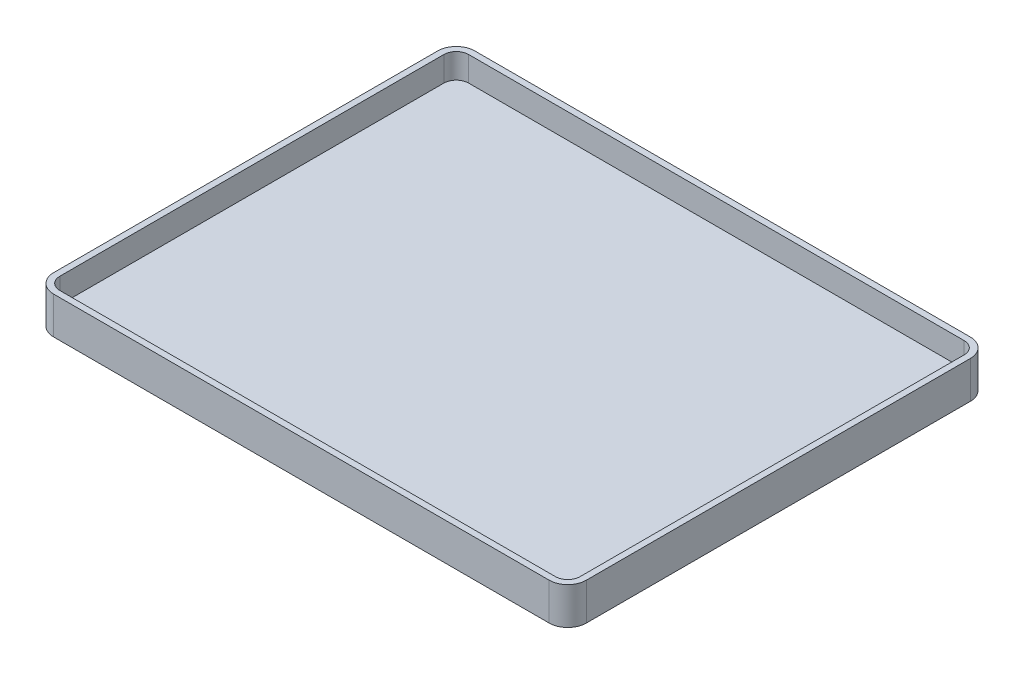
ISO-10303-21;
HEADER;
FILE_DESCRIPTION(('STEP AP214'),'2;1');
FILE_NAME('part.step','',(''),(''),'','','');
FILE_SCHEMA(('AUTOMOTIVE_DESIGN { 1 0 10303 214 1 1 1 1 }'));
ENDSEC;
DATA;
#1=APPLICATION_CONTEXT('core data for automotive mechanical design processes');
#2=APPLICATION_PROTOCOL_DEFINITION('international standard','automotive_design',2000,#1);
#3=PRODUCT_CONTEXT('',#1,'mechanical');
#4=PRODUCT('Part','Part','',(#3));
#5=PRODUCT_RELATED_PRODUCT_CATEGORY('part','',(#4));
#6=PRODUCT_DEFINITION_FORMATION('','',#4);
#7=PRODUCT_DEFINITION_CONTEXT('part definition',#1,'design');
#8=PRODUCT_DEFINITION('design','',#6,#7);
#9=PRODUCT_DEFINITION_SHAPE('','',#8);
#10=(LENGTH_UNIT() NAMED_UNIT(*) SI_UNIT(.MILLI.,.METRE.));
#11=(NAMED_UNIT(*) PLANE_ANGLE_UNIT() SI_UNIT($,.RADIAN.));
#12=(NAMED_UNIT(*) SI_UNIT($,.STERADIAN.) SOLID_ANGLE_UNIT());
#13=UNCERTAINTY_MEASURE_WITH_UNIT(LENGTH_MEASURE(1.E-05),#10,'distance_accuracy_value','');
#14=(GEOMETRIC_REPRESENTATION_CONTEXT(3) GLOBAL_UNCERTAINTY_ASSIGNED_CONTEXT((#13)) GLOBAL_UNIT_ASSIGNED_CONTEXT((#10,
#11,#12)) REPRESENTATION_CONTEXT('',''));
#15=CARTESIAN_POINT('',(0.,0.,0.));
#16=DIRECTION('',(0.,0.,1.));
#17=DIRECTION('',(1.,0.,0.));
#18=AXIS2_PLACEMENT_3D('',#15,#16,#17);
#19=CARTESIAN_POINT('',(0.,19.05,0.));
#20=DIRECTION('',(1.,0.,0.));
#21=DIRECTION('',(0.,0.,-1.));
#22=AXIS2_PLACEMENT_3D('',#19,#20,#21);
#23=PLANE('',#22);
#24=DIRECTION('',(0.,0.,1.));
#25=VECTOR('',#24,1.);
#26=CARTESIAN_POINT('',(0.,0.,0.));
#27=LINE('',#26,#25);
#28=CARTESIAN_POINT('',(0.,0.,-206.375));
#29=VERTEX_POINT('',#28);
#30=CARTESIAN_POINT('',(0.,0.,-9.525));
#31=VERTEX_POINT('',#30);
#32=EDGE_CURVE('E206',#29,#31,#27,.T.);
#33=ORIENTED_EDGE('',*,*,#32,.T.);
#34=DIRECTION('',(0.,-1.,0.));
#35=VECTOR('',#34,1.);
#36=CARTESIAN_POINT('',(0.,19.05,-9.525));
#37=LINE('',#36,#35);
#38=CARTESIAN_POINT('',(0.,19.05,-9.525));
#39=VERTEX_POINT('',#38);
#40=EDGE_CURVE('E11',#31,#39,#37,.F.);
#41=ORIENTED_EDGE('',*,*,#40,.T.);
#42=DIRECTION('',(0.,0.,1.));
#43=VECTOR('',#42,1.);
#44=CARTESIAN_POINT('',(0.,19.05,0.));
#45=LINE('',#44,#43);
#46=CARTESIAN_POINT('',(0.,19.05,-206.375));
#47=VERTEX_POINT('',#46);
#48=EDGE_CURVE('E218',#47,#39,#45,.T.);
#49=ORIENTED_EDGE('',*,*,#48,.F.);
#50=DIRECTION('',(0.,-1.,0.));
#51=VECTOR('',#50,1.);
#52=CARTESIAN_POINT('',(0.,19.05,-206.375));
#53=LINE('',#52,#51);
#54=EDGE_CURVE('E41',#47,#29,#53,.T.);
#55=ORIENTED_EDGE('',*,*,#54,.T.);
#56=EDGE_LOOP('',(#33,#41,#49,#55));
#57=FACE_BOUND('',#56,.T.);
#58=ADVANCED_FACE('F33',(#57),#23,.F.);
#59=CARTESIAN_POINT('',(0.,19.05,0.));
#60=DIRECTION('',(0.,0.,-1.));
#61=DIRECTION('',(-1.,0.,0.));
#62=AXIS2_PLACEMENT_3D('',#59,#60,#61);
#63=PLANE('',#62);
#64=DIRECTION('',(1.,0.,0.));
#65=VECTOR('',#64,1.);
#66=CARTESIAN_POINT('',(0.,0.,0.));
#67=LINE('',#66,#65);
#68=CARTESIAN_POINT('',(9.525,0.,0.));
#69=VERTEX_POINT('',#68);
#70=CARTESIAN_POINT('',(263.525,0.,0.));
#71=VERTEX_POINT('',#70);
#72=EDGE_CURVE('E233',#69,#71,#67,.T.);
#73=ORIENTED_EDGE('',*,*,#72,.T.);
#74=DIRECTION('',(0.,-1.,0.));
#75=VECTOR('',#74,1.);
#76=CARTESIAN_POINT('',(263.525,19.05,0.));
#77=LINE('',#76,#75);
#78=CARTESIAN_POINT('',(263.525,19.05,0.));
#79=VERTEX_POINT('',#78);
#80=EDGE_CURVE('E255',#71,#79,#77,.F.);
#81=ORIENTED_EDGE('',*,*,#80,.T.);
#82=DIRECTION('',(1.,0.,0.));
#83=VECTOR('',#82,1.);
#84=CARTESIAN_POINT('',(0.,19.05,0.));
#85=LINE('',#84,#83);
#86=CARTESIAN_POINT('',(9.525,19.05,0.));
#87=VERTEX_POINT('',#86);
#88=EDGE_CURVE('E221',#87,#79,#85,.T.);
#89=ORIENTED_EDGE('',*,*,#88,.F.);
#90=DIRECTION('',(0.,-1.,0.));
#91=VECTOR('',#90,1.);
#92=CARTESIAN_POINT('',(9.525,19.05,0.));
#93=LINE('',#92,#91);
#94=EDGE_CURVE('E252',#87,#69,#93,.T.);
#95=ORIENTED_EDGE('',*,*,#94,.T.);
#96=EDGE_LOOP('',(#73,#81,#89,#95));
#97=FACE_BOUND('',#96,.T.);
#98=ADVANCED_FACE('F287',(#97),#63,.F.);
#99=CARTESIAN_POINT('',(273.05,19.05,0.));
#100=DIRECTION('',(-1.,0.,0.));
#101=DIRECTION('',(0.,0.,1.));
#102=AXIS2_PLACEMENT_3D('',#99,#100,#101);
#103=PLANE('',#102);
#104=DIRECTION('',(0.,0.,-1.));
#105=VECTOR('',#104,1.);
#106=CARTESIAN_POINT('',(273.05,19.05,0.));
#107=LINE('',#106,#105);
#108=CARTESIAN_POINT('',(273.05,19.05,-9.525));
#109=VERTEX_POINT('',#108);
#110=CARTESIAN_POINT('',(273.05,19.05,-206.375));
#111=VERTEX_POINT('',#110);
#112=EDGE_CURVE('E225',#109,#111,#107,.T.);
#113=ORIENTED_EDGE('',*,*,#112,.F.);
#114=DIRECTION('',(0.,-1.,0.));
#115=VECTOR('',#114,1.);
#116=CARTESIAN_POINT('',(273.05,19.05,-9.525));
#117=LINE('',#116,#115);
#118=CARTESIAN_POINT('',(273.05,0.,-9.525));
#119=VERTEX_POINT('',#118);
#120=EDGE_CURVE('E241',#109,#119,#117,.T.);
#121=ORIENTED_EDGE('',*,*,#120,.T.);
#122=DIRECTION('',(0.,0.,-1.));
#123=VECTOR('',#122,1.);
#124=CARTESIAN_POINT('',(273.05,0.,0.));
#125=LINE('',#124,#123);
#126=CARTESIAN_POINT('',(273.05,0.,-206.375));
#127=VERTEX_POINT('',#126);
#128=EDGE_CURVE('E236',#119,#127,#125,.T.);
#129=ORIENTED_EDGE('',*,*,#128,.T.);
#130=DIRECTION('',(0.,-1.,0.));
#131=VECTOR('',#130,1.);
#132=CARTESIAN_POINT('',(273.05,19.05,-206.375));
#133=LINE('',#132,#131);
#134=EDGE_CURVE('E230',#127,#111,#133,.F.);
#135=ORIENTED_EDGE('',*,*,#134,.T.);
#136=EDGE_LOOP('',(#113,#121,#129,#135));
#137=FACE_BOUND('',#136,.T.);
#138=ADVANCED_FACE('F297',(#137),#103,.F.);
#139=CARTESIAN_POINT('',(0.,19.05,-215.9));
#140=DIRECTION('',(0.,0.,1.));
#141=DIRECTION('',(1.,0.,0.));
#142=AXIS2_PLACEMENT_3D('',#139,#140,#141);
#143=PLANE('',#142);
#144=DIRECTION('',(-1.,0.,0.));
#145=VECTOR('',#144,1.);
#146=CARTESIAN_POINT('',(0.,19.05,-215.9));
#147=LINE('',#146,#145);
#148=CARTESIAN_POINT('',(263.525,19.05,-215.9));
#149=VERTEX_POINT('',#148);
#150=CARTESIAN_POINT('',(9.525,19.05,-215.9));
#151=VERTEX_POINT('',#150);
#152=EDGE_CURVE('E228',#149,#151,#147,.T.);
#153=ORIENTED_EDGE('',*,*,#152,.F.);
#154=DIRECTION('',(0.,-1.,0.));
#155=VECTOR('',#154,1.);
#156=CARTESIAN_POINT('',(263.525,19.05,-215.9));
#157=LINE('',#156,#155);
#158=CARTESIAN_POINT('',(263.525,0.,-215.9));
#159=VERTEX_POINT('',#158);
#160=EDGE_CURVE('E266',#149,#159,#157,.T.);
#161=ORIENTED_EDGE('',*,*,#160,.T.);
#162=DIRECTION('',(-1.,0.,0.));
#163=VECTOR('',#162,1.);
#164=CARTESIAN_POINT('',(0.,0.,-215.9));
#165=LINE('',#164,#163);
#166=CARTESIAN_POINT('',(9.525,0.,-215.9));
#167=VERTEX_POINT('',#166);
#168=EDGE_CURVE('E222',#159,#167,#165,.T.);
#169=ORIENTED_EDGE('',*,*,#168,.T.);
#170=DIRECTION('',(0.,-1.,0.));
#171=VECTOR('',#170,1.);
#172=CARTESIAN_POINT('',(9.525,19.05,-215.9));
#173=LINE('',#172,#171);
#174=EDGE_CURVE('E56',#167,#151,#173,.F.);
#175=ORIENTED_EDGE('',*,*,#174,.T.);
#176=EDGE_LOOP('',(#153,#161,#169,#175));
#177=FACE_BOUND('',#176,.T.);
#178=ADVANCED_FACE('F303',(#177),#143,.F.);
#179=CARTESIAN_POINT('',(0.,19.05,0.));
#180=DIRECTION('',(0.,-1.,0.));
#181=DIRECTION('',(0.,0.,-1.));
#182=AXIS2_PLACEMENT_3D('',#179,#180,#181);
#183=PLANE('',#182);
#184=DIRECTION('',(-1.,0.,0.));
#185=VECTOR('',#184,1.);
#186=CARTESIAN_POINT('',(263.525,19.05,-212.725));
#187=LINE('',#186,#185);
#188=CARTESIAN_POINT('',(263.525,19.05,-212.725));
#189=VERTEX_POINT('',#188);
#190=CARTESIAN_POINT('',(9.52500000000001,19.05,-212.725));
#191=VERTEX_POINT('',#190);
#192=EDGE_CURVE('E188',#189,#191,#187,.T.);
#193=ORIENTED_EDGE('',*,*,#192,.F.);
#194=CARTESIAN_POINT('',(263.525,19.05,-206.375));
#195=DIRECTION('',(0.,1.,0.));
#196=DIRECTION('',(0.,0.,1.));
#197=AXIS2_PLACEMENT_3D('',#194,#195,#196);
#198=CIRCLE('',#197,6.35000000000002);
#199=CARTESIAN_POINT('',(269.875,19.05,-206.375));
#200=VERTEX_POINT('',#199);
#201=EDGE_CURVE('E48',#200,#189,#198,.T.);
#202=ORIENTED_EDGE('',*,*,#201,.F.);
#203=DIRECTION('',(0.,0.,-1.));
#204=VECTOR('',#203,1.);
#205=CARTESIAN_POINT('',(269.875,19.05,-9.525));
#206=LINE('',#205,#204);
#207=CARTESIAN_POINT('',(269.875,19.05,-9.525));
#208=VERTEX_POINT('',#207);
#209=EDGE_CURVE('E168',#208,#200,#206,.T.);
#210=ORIENTED_EDGE('',*,*,#209,.F.);
#211=CARTESIAN_POINT('',(263.525,19.05,-9.525));
#212=DIRECTION('',(0.,1.,0.));
#213=DIRECTION('',(0.,0.,1.));
#214=AXIS2_PLACEMENT_3D('',#211,#212,#213);
#215=CIRCLE('',#214,6.35000000000001);
#216=CARTESIAN_POINT('',(263.525,19.05,-3.17499999999999));
#217=VERTEX_POINT('',#216);
#218=EDGE_CURVE('E171',#217,#208,#215,.T.);
#219=ORIENTED_EDGE('',*,*,#218,.F.);
#220=DIRECTION('',(1.,0.,0.));
#221=VECTOR('',#220,1.);
#222=CARTESIAN_POINT('',(9.525,19.05,-3.175));
#223=LINE('',#222,#221);
#224=CARTESIAN_POINT('',(9.525,19.05,-3.175));
#225=VERTEX_POINT('',#224);
#226=EDGE_CURVE('E199',#225,#217,#223,.T.);
#227=ORIENTED_EDGE('',*,*,#226,.F.);
#228=CARTESIAN_POINT('',(9.525,19.05,-9.525));
#229=DIRECTION('',(0.,1.,0.));
#230=DIRECTION('',(0.,0.,1.));
#231=AXIS2_PLACEMENT_3D('',#228,#229,#230);
#232=CIRCLE('',#231,6.35);
#233=CARTESIAN_POINT('',(3.175,19.05,-9.52500000000001));
#234=VERTEX_POINT('',#233);
#235=EDGE_CURVE('E196',#234,#225,#232,.T.);
#236=ORIENTED_EDGE('',*,*,#235,.F.);
#237=DIRECTION('',(0.,0.,1.));
#238=VECTOR('',#237,1.);
#239=CARTESIAN_POINT('',(3.175,19.05,-206.375));
#240=LINE('',#239,#238);
#241=CARTESIAN_POINT('',(3.175,19.05,-206.375));
#242=VERTEX_POINT('',#241);
#243=EDGE_CURVE('E193',#242,#234,#240,.T.);
#244=ORIENTED_EDGE('',*,*,#243,.F.);
#245=CARTESIAN_POINT('',(9.525,19.05,-206.375));
#246=DIRECTION('',(0.,1.,0.));
#247=DIRECTION('',(0.,0.,1.));
#248=AXIS2_PLACEMENT_3D('',#245,#246,#247);
#249=CIRCLE('',#248,6.35);
#250=EDGE_CURVE('E190',#191,#242,#249,.T.);
#251=ORIENTED_EDGE('',*,*,#250,.F.);
#252=EDGE_LOOP('',(#193,#202,#210,#219,#227,#236,#244,#251));
#253=FACE_BOUND('',#252,.T.);
#254=ORIENTED_EDGE('',*,*,#88,.T.);
#255=CARTESIAN_POINT('',(263.525,19.05,-9.525));
#256=DIRECTION('',(0.,-1.,0.));
#257=DIRECTION('',(0.,0.,-1.));
#258=AXIS2_PLACEMENT_3D('',#255,#256,#257);
#259=CIRCLE('',#258,9.525);
#260=EDGE_CURVE('E263',#79,#109,#259,.F.);
#261=ORIENTED_EDGE('',*,*,#260,.T.);
#262=ORIENTED_EDGE('',*,*,#112,.T.);
#263=CARTESIAN_POINT('',(263.525,19.05,-206.375));
#264=DIRECTION('',(0.,-1.,0.));
#265=DIRECTION('',(0.,0.,-1.));
#266=AXIS2_PLACEMENT_3D('',#263,#264,#265);
#267=CIRCLE('',#266,9.525);
#268=EDGE_CURVE('E261',#111,#149,#267,.F.);
#269=ORIENTED_EDGE('',*,*,#268,.T.);
#270=ORIENTED_EDGE('',*,*,#152,.T.);
#271=CARTESIAN_POINT('',(9.525,19.05,-206.375));
#272=DIRECTION('',(0.,-1.,0.));
#273=DIRECTION('',(0.,0.,-1.));
#274=AXIS2_PLACEMENT_3D('',#271,#272,#273);
#275=CIRCLE('',#274,9.525);
#276=EDGE_CURVE('E257',#151,#47,#275,.F.);
#277=ORIENTED_EDGE('',*,*,#276,.T.);
#278=ORIENTED_EDGE('',*,*,#48,.T.);
#279=CARTESIAN_POINT('',(9.525,19.05,-9.525));
#280=DIRECTION('',(0.,-1.,0.));
#281=DIRECTION('',(0.,0.,-1.));
#282=AXIS2_PLACEMENT_3D('',#279,#280,#281);
#283=CIRCLE('',#282,9.525);
#284=EDGE_CURVE('E259',#39,#87,#283,.F.);
#285=ORIENTED_EDGE('',*,*,#284,.T.);
#286=EDGE_LOOP('',(#254,#261,#262,#269,#270,#277,#278,#285));
#287=FACE_BOUND('',#286,.T.);
#288=ADVANCED_FACE('F291',(#253,#287),#183,.F.);
#289=CARTESIAN_POINT('',(0.,0.,0.));
#290=DIRECTION('',(0.,-1.,0.));
#291=DIRECTION('',(0.,0.,-1.));
#292=AXIS2_PLACEMENT_3D('',#289,#290,#291);
#293=PLANE('',#292);
#294=ORIENTED_EDGE('',*,*,#128,.F.);
#295=CARTESIAN_POINT('',(263.525,0.,-9.525));
#296=DIRECTION('',(0.,-1.,0.));
#297=DIRECTION('',(0.,0.,-1.));
#298=AXIS2_PLACEMENT_3D('',#295,#296,#297);
#299=CIRCLE('',#298,9.525);
#300=EDGE_CURVE('E250',#119,#71,#299,.T.);
#301=ORIENTED_EDGE('',*,*,#300,.T.);
#302=ORIENTED_EDGE('',*,*,#72,.F.);
#303=CARTESIAN_POINT('',(9.525,0.,-9.525));
#304=DIRECTION('',(0.,-1.,0.));
#305=DIRECTION('',(0.,0.,-1.));
#306=AXIS2_PLACEMENT_3D('',#303,#304,#305);
#307=CIRCLE('',#306,9.525);
#308=EDGE_CURVE('E246',#69,#31,#307,.T.);
#309=ORIENTED_EDGE('',*,*,#308,.T.);
#310=ORIENTED_EDGE('',*,*,#32,.F.);
#311=CARTESIAN_POINT('',(9.525,0.,-206.375));
#312=DIRECTION('',(0.,-1.,0.));
#313=DIRECTION('',(0.,0.,-1.));
#314=AXIS2_PLACEMENT_3D('',#311,#312,#313);
#315=CIRCLE('',#314,9.525);
#316=EDGE_CURVE('E244',#29,#167,#315,.T.);
#317=ORIENTED_EDGE('',*,*,#316,.T.);
#318=ORIENTED_EDGE('',*,*,#168,.F.);
#319=CARTESIAN_POINT('',(263.525,0.,-206.375));
#320=DIRECTION('',(0.,-1.,0.));
#321=DIRECTION('',(0.,0.,-1.));
#322=AXIS2_PLACEMENT_3D('',#319,#320,#321);
#323=CIRCLE('',#322,9.525);
#324=EDGE_CURVE('E248',#159,#127,#323,.T.);
#325=ORIENTED_EDGE('',*,*,#324,.T.);
#326=EDGE_LOOP('',(#294,#301,#302,#309,#310,#317,#318,#325));
#327=FACE_BOUND('',#326,.T.);
#328=ADVANCED_FACE('F278',(#327),#293,.T.);
#329=CARTESIAN_POINT('',(263.525,19.05,-9.525));
#330=DIRECTION('',(0.,-1.,0.));
#331=DIRECTION('',(0.,0.,-1.));
#332=AXIS2_PLACEMENT_3D('',#329,#330,#331);
#333=CYLINDRICAL_SURFACE('',#332,9.525);
#334=ORIENTED_EDGE('',*,*,#260,.F.);
#335=ORIENTED_EDGE('',*,*,#80,.F.);
#336=ORIENTED_EDGE('',*,*,#300,.F.);
#337=ORIENTED_EDGE('',*,*,#120,.F.);
#338=EDGE_LOOP('',(#334,#335,#336,#337));
#339=FACE_BOUND('',#338,.T.);
#340=ADVANCED_FACE('F295',(#339),#333,.T.);
#341=CARTESIAN_POINT('',(263.525,19.05,-206.375));
#342=DIRECTION('',(0.,-1.,0.));
#343=DIRECTION('',(0.,0.,-1.));
#344=AXIS2_PLACEMENT_3D('',#341,#342,#343);
#345=CYLINDRICAL_SURFACE('',#344,9.525);
#346=ORIENTED_EDGE('',*,*,#268,.F.);
#347=ORIENTED_EDGE('',*,*,#134,.F.);
#348=ORIENTED_EDGE('',*,*,#324,.F.);
#349=ORIENTED_EDGE('',*,*,#160,.F.);
#350=EDGE_LOOP('',(#346,#347,#348,#349));
#351=FACE_BOUND('',#350,.T.);
#352=ADVANCED_FACE('F302',(#351),#345,.T.);
#353=CARTESIAN_POINT('',(9.525,19.05,-9.525));
#354=DIRECTION('',(0.,-1.,0.));
#355=DIRECTION('',(0.,0.,-1.));
#356=AXIS2_PLACEMENT_3D('',#353,#354,#355);
#357=CYLINDRICAL_SURFACE('',#356,9.525);
#358=ORIENTED_EDGE('',*,*,#284,.F.);
#359=ORIENTED_EDGE('',*,*,#40,.F.);
#360=ORIENTED_EDGE('',*,*,#308,.F.);
#361=ORIENTED_EDGE('',*,*,#94,.F.);
#362=EDGE_LOOP('',(#358,#359,#360,#361));
#363=FACE_BOUND('',#362,.T.);
#364=ADVANCED_FACE('F284',(#363),#357,.T.);
#365=CARTESIAN_POINT('',(9.525,19.05,-206.375));
#366=DIRECTION('',(0.,-1.,0.));
#367=DIRECTION('',(0.,0.,-1.));
#368=AXIS2_PLACEMENT_3D('',#365,#366,#367);
#369=CYLINDRICAL_SURFACE('',#368,9.525);
#370=ORIENTED_EDGE('',*,*,#276,.F.);
#371=ORIENTED_EDGE('',*,*,#174,.F.);
#372=ORIENTED_EDGE('',*,*,#316,.F.);
#373=ORIENTED_EDGE('',*,*,#54,.F.);
#374=EDGE_LOOP('',(#370,#371,#372,#373));
#375=FACE_BOUND('',#374,.T.);
#376=ADVANCED_FACE('F35',(#375),#369,.T.);
#377=CARTESIAN_POINT('',(263.525,6.35,-206.375));
#378=DIRECTION('',(0.,1.,0.));
#379=DIRECTION('',(0.,0.,1.));
#380=AXIS2_PLACEMENT_3D('',#377,#378,#379);
#381=CYLINDRICAL_SURFACE('',#380,6.35000000000002);
#382=ORIENTED_EDGE('',*,*,#201,.T.);
#383=DIRECTION('',(0.,1.,0.));
#384=VECTOR('',#383,1.);
#385=CARTESIAN_POINT('',(263.525,6.35,-212.725));
#386=LINE('',#385,#384);
#387=CARTESIAN_POINT('',(263.525,6.35,-212.725));
#388=VERTEX_POINT('',#387);
#389=EDGE_CURVE('E145',#388,#189,#386,.T.);
#390=ORIENTED_EDGE('',*,*,#389,.F.);
#391=CARTESIAN_POINT('',(263.525,6.35,-206.375));
#392=DIRECTION('',(0.,1.,0.));
#393=DIRECTION('',(0.,0.,1.));
#394=AXIS2_PLACEMENT_3D('',#391,#392,#393);
#395=CIRCLE('',#394,6.35000000000002);
#396=CARTESIAN_POINT('',(269.875,6.35,-206.375));
#397=VERTEX_POINT('',#396);
#398=EDGE_CURVE('E149',#397,#388,#395,.T.);
#399=ORIENTED_EDGE('',*,*,#398,.F.);
#400=DIRECTION('',(0.,1.,0.));
#401=VECTOR('',#400,1.);
#402=CARTESIAN_POINT('',(269.875,6.35,-206.375));
#403=LINE('',#402,#401);
#404=EDGE_CURVE('E204',#397,#200,#403,.T.);
#405=ORIENTED_EDGE('',*,*,#404,.T.);
#406=EDGE_LOOP('',(#382,#390,#399,#405));
#407=FACE_BOUND('',#406,.T.);
#408=ADVANCED_FACE('F147',(#407),#381,.F.);
#409=CARTESIAN_POINT('',(269.875,6.35,-9.525));
#410=DIRECTION('',(1.,0.,0.));
#411=DIRECTION('',(0.,0.,-1.));
#412=AXIS2_PLACEMENT_3D('',#409,#410,#411);
#413=PLANE('',#412);
#414=ORIENTED_EDGE('',*,*,#209,.T.);
#415=ORIENTED_EDGE('',*,*,#404,.F.);
#416=DIRECTION('',(0.,0.,-1.));
#417=VECTOR('',#416,1.);
#418=CARTESIAN_POINT('',(269.875,6.35,-9.525));
#419=LINE('',#418,#417);
#420=CARTESIAN_POINT('',(269.875,6.35,-9.525));
#421=VERTEX_POINT('',#420);
#422=EDGE_CURVE('E155',#421,#397,#419,.T.);
#423=ORIENTED_EDGE('',*,*,#422,.F.);
#424=DIRECTION('',(0.,1.,0.));
#425=VECTOR('',#424,1.);
#426=CARTESIAN_POINT('',(269.875,6.35,-9.525));
#427=LINE('',#426,#425);
#428=EDGE_CURVE('E207',#421,#208,#427,.T.);
#429=ORIENTED_EDGE('',*,*,#428,.T.);
#430=EDGE_LOOP('',(#414,#415,#423,#429));
#431=FACE_BOUND('',#430,.T.);
#432=ADVANCED_FACE('F309',(#431),#413,.F.);
#433=CARTESIAN_POINT('',(263.525,6.35,-9.525));
#434=DIRECTION('',(0.,1.,0.));
#435=DIRECTION('',(0.,0.,1.));
#436=AXIS2_PLACEMENT_3D('',#433,#434,#435);
#437=CYLINDRICAL_SURFACE('',#436,6.35000000000001);
#438=ORIENTED_EDGE('',*,*,#218,.T.);
#439=ORIENTED_EDGE('',*,*,#428,.F.);
#440=CARTESIAN_POINT('',(263.525,6.35,-9.525));
#441=DIRECTION('',(0.,1.,0.));
#442=DIRECTION('',(0.,0.,1.));
#443=AXIS2_PLACEMENT_3D('',#440,#441,#442);
#444=CIRCLE('',#443,6.35000000000001);
#445=CARTESIAN_POINT('',(263.525,6.35,-3.17499999999999));
#446=VERTEX_POINT('',#445);
#447=EDGE_CURVE('E184',#446,#421,#444,.T.);
#448=ORIENTED_EDGE('',*,*,#447,.F.);
#449=DIRECTION('',(0.,1.,0.));
#450=VECTOR('',#449,1.);
#451=CARTESIAN_POINT('',(263.525,6.35,-3.17499999999999));
#452=LINE('',#451,#450);
#453=EDGE_CURVE('E209',#446,#217,#452,.T.);
#454=ORIENTED_EDGE('',*,*,#453,.T.);
#455=EDGE_LOOP('',(#438,#439,#448,#454));
#456=FACE_BOUND('',#455,.T.);
#457=ADVANCED_FACE('F362',(#456),#437,.F.);
#458=CARTESIAN_POINT('',(9.525,6.35,-3.175));
#459=DIRECTION('',(0.,0.,1.));
#460=DIRECTION('',(1.,0.,0.));
#461=AXIS2_PLACEMENT_3D('',#458,#459,#460);
#462=PLANE('',#461);
#463=ORIENTED_EDGE('',*,*,#226,.T.);
#464=ORIENTED_EDGE('',*,*,#453,.F.);
#465=DIRECTION('',(1.,0.,0.));
#466=VECTOR('',#465,1.);
#467=CARTESIAN_POINT('',(9.525,6.35,-3.175));
#468=LINE('',#467,#466);
#469=CARTESIAN_POINT('',(9.525,6.35,-3.175));
#470=VERTEX_POINT('',#469);
#471=EDGE_CURVE('E181',#470,#446,#468,.T.);
#472=ORIENTED_EDGE('',*,*,#471,.F.);
#473=DIRECTION('',(0.,1.,0.));
#474=VECTOR('',#473,1.);
#475=CARTESIAN_POINT('',(9.525,6.35,-3.175));
#476=LINE('',#475,#474);
#477=EDGE_CURVE('E211',#470,#225,#476,.T.);
#478=ORIENTED_EDGE('',*,*,#477,.T.);
#479=EDGE_LOOP('',(#463,#464,#472,#478));
#480=FACE_BOUND('',#479,.T.);
#481=ADVANCED_FACE('F372',(#480),#462,.F.);
#482=CARTESIAN_POINT('',(9.525,6.35,-9.525));
#483=DIRECTION('',(0.,1.,0.));
#484=DIRECTION('',(0.,0.,1.));
#485=AXIS2_PLACEMENT_3D('',#482,#483,#484);
#486=CYLINDRICAL_SURFACE('',#485,6.35);
#487=ORIENTED_EDGE('',*,*,#235,.T.);
#488=ORIENTED_EDGE('',*,*,#477,.F.);
#489=CARTESIAN_POINT('',(9.525,6.35,-9.525));
#490=DIRECTION('',(0.,1.,0.));
#491=DIRECTION('',(0.,0.,1.));
#492=AXIS2_PLACEMENT_3D('',#489,#490,#491);
#493=CIRCLE('',#492,6.35);
#494=CARTESIAN_POINT('',(3.175,6.35,-9.52500000000001));
#495=VERTEX_POINT('',#494);
#496=EDGE_CURVE('E178',#495,#470,#493,.T.);
#497=ORIENTED_EDGE('',*,*,#496,.F.);
#498=DIRECTION('',(0.,1.,0.));
#499=VECTOR('',#498,1.);
#500=CARTESIAN_POINT('',(3.175,6.35,-9.52500000000001));
#501=LINE('',#500,#499);
#502=EDGE_CURVE('E213',#495,#234,#501,.T.);
#503=ORIENTED_EDGE('',*,*,#502,.T.);
#504=EDGE_LOOP('',(#487,#488,#497,#503));
#505=FACE_BOUND('',#504,.T.);
#506=ADVANCED_FACE('F382',(#505),#486,.F.);
#507=CARTESIAN_POINT('',(3.175,6.35,-206.375));
#508=DIRECTION('',(-1.,0.,0.));
#509=DIRECTION('',(0.,0.,1.));
#510=AXIS2_PLACEMENT_3D('',#507,#508,#509);
#511=PLANE('',#510);
#512=ORIENTED_EDGE('',*,*,#243,.T.);
#513=ORIENTED_EDGE('',*,*,#502,.F.);
#514=DIRECTION('',(0.,0.,1.));
#515=VECTOR('',#514,1.);
#516=CARTESIAN_POINT('',(3.175,6.35,-206.375));
#517=LINE('',#516,#515);
#518=CARTESIAN_POINT('',(3.175,6.35,-206.375));
#519=VERTEX_POINT('',#518);
#520=EDGE_CURVE('E175',#519,#495,#517,.T.);
#521=ORIENTED_EDGE('',*,*,#520,.F.);
#522=DIRECTION('',(0.,1.,0.));
#523=VECTOR('',#522,1.);
#524=CARTESIAN_POINT('',(3.175,6.35,-206.375));
#525=LINE('',#524,#523);
#526=EDGE_CURVE('E215',#519,#242,#525,.T.);
#527=ORIENTED_EDGE('',*,*,#526,.T.);
#528=EDGE_LOOP('',(#512,#513,#521,#527));
#529=FACE_BOUND('',#528,.T.);
#530=ADVANCED_FACE('F392',(#529),#511,.F.);
#531=CARTESIAN_POINT('',(9.525,6.35,-206.375));
#532=DIRECTION('',(0.,1.,0.));
#533=DIRECTION('',(0.,0.,1.));
#534=AXIS2_PLACEMENT_3D('',#531,#532,#533);
#535=CYLINDRICAL_SURFACE('',#534,6.35);
#536=ORIENTED_EDGE('',*,*,#250,.T.);
#537=ORIENTED_EDGE('',*,*,#526,.F.);
#538=CARTESIAN_POINT('',(9.525,6.35,-206.375));
#539=DIRECTION('',(0.,1.,0.));
#540=DIRECTION('',(0.,0.,1.));
#541=AXIS2_PLACEMENT_3D('',#538,#539,#540);
#542=CIRCLE('',#541,6.35);
#543=CARTESIAN_POINT('',(9.52500000000001,6.35,-212.725));
#544=VERTEX_POINT('',#543);
#545=EDGE_CURVE('E163',#544,#519,#542,.T.);
#546=ORIENTED_EDGE('',*,*,#545,.F.);
#547=DIRECTION('',(0.,1.,0.));
#548=VECTOR('',#547,1.);
#549=CARTESIAN_POINT('',(9.52500000000001,6.35,-212.725));
#550=LINE('',#549,#548);
#551=EDGE_CURVE('E154',#544,#191,#550,.T.);
#552=ORIENTED_EDGE('',*,*,#551,.T.);
#553=EDGE_LOOP('',(#536,#537,#546,#552));
#554=FACE_BOUND('',#553,.T.);
#555=ADVANCED_FACE('F402',(#554),#535,.F.);
#556=CARTESIAN_POINT('',(263.525,6.35,-212.725));
#557=DIRECTION('',(0.,0.,-1.));
#558=DIRECTION('',(-1.,0.,0.));
#559=AXIS2_PLACEMENT_3D('',#556,#557,#558);
#560=PLANE('',#559);
#561=ORIENTED_EDGE('',*,*,#192,.T.);
#562=ORIENTED_EDGE('',*,*,#551,.F.);
#563=DIRECTION('',(-1.,0.,0.));
#564=VECTOR('',#563,1.);
#565=CARTESIAN_POINT('',(263.525,6.35,-212.725));
#566=LINE('',#565,#564);
#567=EDGE_CURVE('E158',#388,#544,#566,.T.);
#568=ORIENTED_EDGE('',*,*,#567,.F.);
#569=ORIENTED_EDGE('',*,*,#389,.T.);
#570=EDGE_LOOP('',(#561,#562,#568,#569));
#571=FACE_BOUND('',#570,.T.);
#572=ADVANCED_FACE('F159',(#571),#560,.F.);
#573=CARTESIAN_POINT('',(263.525,6.35,-206.375));
#574=DIRECTION('',(0.,1.,0.));
#575=DIRECTION('',(0.,0.,1.));
#576=AXIS2_PLACEMENT_3D('',#573,#574,#575);
#577=PLANE('',#576);
#578=ORIENTED_EDGE('',*,*,#398,.T.);
#579=ORIENTED_EDGE('',*,*,#567,.T.);
#580=ORIENTED_EDGE('',*,*,#545,.T.);
#581=ORIENTED_EDGE('',*,*,#520,.T.);
#582=ORIENTED_EDGE('',*,*,#496,.T.);
#583=ORIENTED_EDGE('',*,*,#471,.T.);
#584=ORIENTED_EDGE('',*,*,#447,.T.);
#585=ORIENTED_EDGE('',*,*,#422,.T.);
#586=EDGE_LOOP('',(#578,#579,#580,#581,#582,#583,#584,#585));
#587=FACE_BOUND('',#586,.T.);
#588=ADVANCED_FACE('F165',(#587),#577,.T.);
#589=CLOSED_SHELL('',(#58,#98,#138,#178,#288,#328,#340,#352,#364,#376,#408,#432,#457,#481,#506,
#530,#555,#572,#588));
#590=MANIFOLD_SOLID_BREP('B2',#589);
#591=ADVANCED_BREP_SHAPE_REPRESENTATION('',(#18,#590),#14);
#592=SHAPE_DEFINITION_REPRESENTATION(#9,#591);
ENDSEC;
END-ISO-10303-21;
